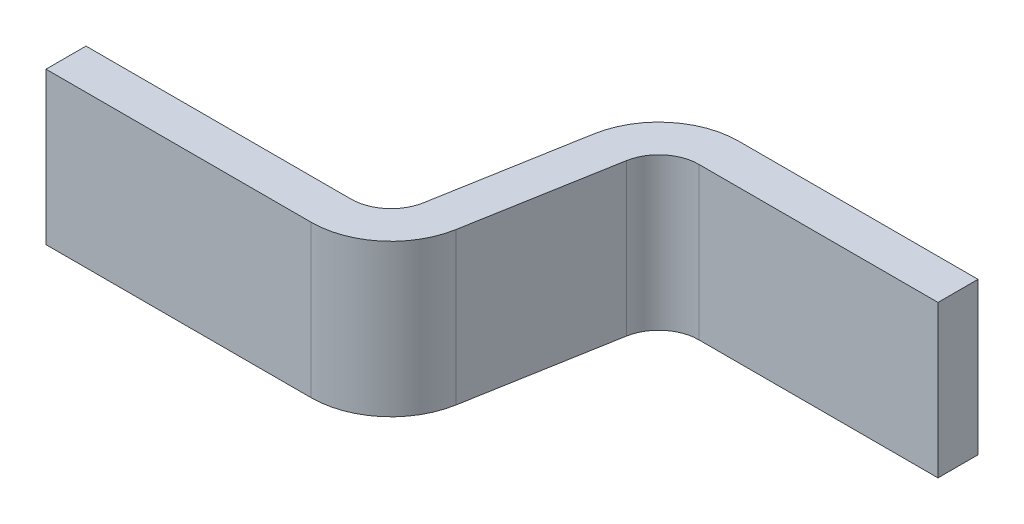
ISO-10303-21;
HEADER;
FILE_DESCRIPTION(('STEP AP214'),'2;1');
FILE_NAME('part.step','',(''),(''),'','','');
FILE_SCHEMA(('AUTOMOTIVE_DESIGN { 1 0 10303 214 1 1 1 1 }'));
ENDSEC;
DATA;
#1=APPLICATION_CONTEXT('core data for automotive mechanical design processes');
#2=APPLICATION_PROTOCOL_DEFINITION('international standard','automotive_design',2000,#1);
#3=PRODUCT_CONTEXT('',#1,'mechanical');
#4=PRODUCT('Part','Part','',(#3));
#5=PRODUCT_RELATED_PRODUCT_CATEGORY('part','',(#4));
#6=PRODUCT_DEFINITION_FORMATION('','',#4);
#7=PRODUCT_DEFINITION_CONTEXT('part definition',#1,'design');
#8=PRODUCT_DEFINITION('design','',#6,#7);
#9=PRODUCT_DEFINITION_SHAPE('','',#8);
#10=(LENGTH_UNIT() NAMED_UNIT(*) SI_UNIT(.MILLI.,.METRE.));
#11=(NAMED_UNIT(*) PLANE_ANGLE_UNIT() SI_UNIT($,.RADIAN.));
#12=(NAMED_UNIT(*) SI_UNIT($,.STERADIAN.) SOLID_ANGLE_UNIT());
#13=UNCERTAINTY_MEASURE_WITH_UNIT(LENGTH_MEASURE(1.E-05),#10,'distance_accuracy_value','');
#14=(GEOMETRIC_REPRESENTATION_CONTEXT(3) GLOBAL_UNCERTAINTY_ASSIGNED_CONTEXT((#13)) GLOBAL_UNIT_ASSIGNED_CONTEXT((#10,
#11,#12)) REPRESENTATION_CONTEXT('',''));
#15=CARTESIAN_POINT('',(0.,0.,0.));
#16=DIRECTION('',(0.,0.,1.));
#17=DIRECTION('',(1.,0.,0.));
#18=AXIS2_PLACEMENT_3D('',#15,#16,#17);
#19=CARTESIAN_POINT('',(2.043923101205,0.38,0.2));
#20=DIRECTION('',(0.,0.,-1.));
#21=DIRECTION('',(-1.,0.,0.));
#22=AXIS2_PLACEMENT_3D('',#19,#20,#21);
#23=PLANE('',#22);
#24=DIRECTION('',(1.,0.,0.));
#25=VECTOR('',#24,1.);
#26=CARTESIAN_POINT('',(2.043923101205,0.38,0.2));
#27=LINE('',#26,#25);
#28=CARTESIAN_POINT('',(3.24,0.38,0.2));
#29=VERTEX_POINT('',#28);
#30=CARTESIAN_POINT('',(2.043923101205,0.38,0.2));
#31=VERTEX_POINT('',#30);
#32=EDGE_CURVE('E153',#29,#31,#27,.F.);
#33=ORIENTED_EDGE('',*,*,#32,.T.);
#34=DIRECTION('',(0.,-1.,0.));
#35=VECTOR('',#34,1.);
#36=CARTESIAN_POINT('',(2.043923101205,0.38,0.2));
#37=LINE('',#36,#35);
#38=CARTESIAN_POINT('',(2.043923101205,-0.38,0.2));
#39=VERTEX_POINT('',#38);
#40=EDGE_CURVE('E99',#31,#39,#37,.T.);
#41=ORIENTED_EDGE('',*,*,#40,.T.);
#42=DIRECTION('',(1.,0.,0.));
#43=VECTOR('',#42,1.);
#44=CARTESIAN_POINT('',(2.043923101205,-0.38,0.2));
#45=LINE('',#44,#43);
#46=CARTESIAN_POINT('',(3.24,-0.38,0.2));
#47=VERTEX_POINT('',#46);
#48=EDGE_CURVE('E134',#39,#47,#45,.T.);
#49=ORIENTED_EDGE('',*,*,#48,.T.);
#50=DIRECTION('',(0.,1.,0.));
#51=VECTOR('',#50,1.);
#52=CARTESIAN_POINT('',(3.24,-0.38,0.2));
#53=LINE('',#52,#51);
#54=EDGE_CURVE('E150',#47,#29,#53,.T.);
#55=ORIENTED_EDGE('',*,*,#54,.T.);
#56=EDGE_LOOP('',(#33,#41,#49,#55));
#57=FACE_BOUND('',#56,.T.);
#58=ADVANCED_FACE('F17',(#57),#23,.F.);
#59=CARTESIAN_POINT('',(3.24,-0.38,0.));
#60=DIRECTION('',(-1.,0.,0.));
#61=DIRECTION('',(0.,0.,1.));
#62=AXIS2_PLACEMENT_3D('',#59,#60,#61);
#63=PLANE('',#62);
#64=DIRECTION('',(0.,0.,1.));
#65=VECTOR('',#64,1.);
#66=CARTESIAN_POINT('',(3.24,0.38,0.));
#67=LINE('',#66,#65);
#68=CARTESIAN_POINT('',(3.24,0.38,0.));
#69=VERTEX_POINT('',#68);
#70=EDGE_CURVE('E137',#29,#69,#67,.F.);
#71=ORIENTED_EDGE('',*,*,#70,.F.);
#72=ORIENTED_EDGE('',*,*,#54,.F.);
#73=DIRECTION('',(0.,0.,1.));
#74=VECTOR('',#73,1.);
#75=CARTESIAN_POINT('',(3.24,-0.38,0.2));
#76=LINE('',#75,#74);
#77=CARTESIAN_POINT('',(3.24,-0.38,0.));
#78=VERTEX_POINT('',#77);
#79=EDGE_CURVE('E133',#47,#78,#76,.F.);
#80=ORIENTED_EDGE('',*,*,#79,.T.);
#81=DIRECTION('',(0.,1.,0.));
#82=VECTOR('',#81,1.);
#83=CARTESIAN_POINT('',(3.24,-0.38,0.));
#84=LINE('',#83,#82);
#85=EDGE_CURVE('E125',#78,#69,#84,.T.);
#86=ORIENTED_EDGE('',*,*,#85,.T.);
#87=EDGE_LOOP('',(#71,#72,#80,#86));
#88=FACE_BOUND('',#87,.T.);
#89=ADVANCED_FACE('F260',(#88),#63,.F.);
#90=CARTESIAN_POINT('',(2.043923101205,0.38,0.4));
#91=DIRECTION('',(0.,-1.,0.));
#92=DIRECTION('',(0.,0.,-1.));
#93=AXIS2_PLACEMENT_3D('',#90,#91,#92);
#94=CYLINDRICAL_SURFACE('',#93,0.2);
#95=CARTESIAN_POINT('',(2.043923101205,0.38,0.4));
#96=DIRECTION('',(0.,-1.,0.));
#97=DIRECTION('',(0.,0.,-1.));
#98=AXIS2_PLACEMENT_3D('',#95,#96,#97);
#99=CIRCLE('',#98,0.2);
#100=CARTESIAN_POINT('',(1.84696155060227,0.38,0.365270364466852));
#101=VERTEX_POINT('',#100);
#102=EDGE_CURVE('E20',#101,#31,#99,.T.);
#103=ORIENTED_EDGE('',*,*,#102,.F.);
#104=DIRECTION('',(0.,1.,0.));
#105=VECTOR('',#104,1.);
#106=CARTESIAN_POINT('',(1.84696155060241,0.38,0.365270364467072));
#107=LINE('',#106,#105);
#108=CARTESIAN_POINT('',(1.84696155060227,-0.38,0.365270364466852));
#109=VERTEX_POINT('',#108);
#110=EDGE_CURVE('E90',#101,#109,#107,.F.);
#111=ORIENTED_EDGE('',*,*,#110,.T.);
#112=CARTESIAN_POINT('',(2.043923101205,-0.38,0.4));
#113=DIRECTION('',(0.,-1.,0.));
#114=DIRECTION('',(0.,0.,-1.));
#115=AXIS2_PLACEMENT_3D('',#112,#113,#114);
#116=CIRCLE('',#115,0.2);
#117=EDGE_CURVE('E146',#39,#109,#116,.F.);
#118=ORIENTED_EDGE('',*,*,#117,.F.);
#119=ORIENTED_EDGE('',*,*,#40,.F.);
#120=EDGE_LOOP('',(#103,#111,#118,#119));
#121=FACE_BOUND('',#120,.T.);
#122=ADVANCED_FACE('F114',(#121),#94,.F.);
#123=CARTESIAN_POINT('',(1.719267507239,0.38,1.089459271067));
#124=DIRECTION('',(-0.98480775301219,0.,-0.173648177667033));
#125=DIRECTION('',(-0.173648177667033,0.,0.98480775301219));
#126=AXIS2_PLACEMENT_3D('',#123,#124,#125);
#127=PLANE('',#126);
#128=DIRECTION('',(-0.173648177666479,0.,0.984807753012288));
#129=VECTOR('',#128,1.);
#130=CARTESIAN_POINT('',(1.846961550602,0.38,0.365270364467));
#131=LINE('',#130,#129);
#132=CARTESIAN_POINT('',(1.71926750723896,0.38,1.0894592710668));
#133=VERTEX_POINT('',#132);
#134=EDGE_CURVE('E94',#101,#133,#131,.T.);
#135=ORIENTED_EDGE('',*,*,#134,.T.);
#136=DIRECTION('',(0.,1.,0.));
#137=VECTOR('',#136,1.);
#138=CARTESIAN_POINT('',(1.71926750723885,0.38,1.08945927106697));
#139=LINE('',#138,#137);
#140=CARTESIAN_POINT('',(1.71926750723896,-0.38,1.0894592710668));
#141=VERTEX_POINT('',#140);
#142=EDGE_CURVE('E111',#141,#133,#139,.T.);
#143=ORIENTED_EDGE('',*,*,#142,.F.);
#144=DIRECTION('',(0.173648177666479,0.,-0.984807753012288));
#145=VECTOR('',#144,1.);
#146=CARTESIAN_POINT('',(1.719267507239,-0.38,1.089459271067));
#147=LINE('',#146,#145);
#148=EDGE_CURVE('E95',#141,#109,#147,.T.);
#149=ORIENTED_EDGE('',*,*,#148,.T.);
#150=ORIENTED_EDGE('',*,*,#110,.F.);
#151=EDGE_LOOP('',(#135,#143,#149,#150));
#152=FACE_BOUND('',#151,.T.);
#153=ADVANCED_FACE('F92',(#152),#127,.F.);
#154=CARTESIAN_POINT('',(2.043923101205,-0.38,0.));
#155=DIRECTION('',(0.,0.,1.));
#156=DIRECTION('',(1.,0.,0.));
#157=AXIS2_PLACEMENT_3D('',#154,#155,#156);
#158=PLANE('',#157);
#159=DIRECTION('',(1.,0.,0.));
#160=VECTOR('',#159,1.);
#161=CARTESIAN_POINT('',(2.043923101205,-0.38,0.));
#162=LINE('',#161,#160);
#163=CARTESIAN_POINT('',(2.043923101205,-0.38,0.));
#164=VERTEX_POINT('',#163);
#165=EDGE_CURVE('E118',#164,#78,#162,.T.);
#166=ORIENTED_EDGE('',*,*,#165,.F.);
#167=DIRECTION('',(0.,-1.,0.));
#168=VECTOR('',#167,1.);
#169=CARTESIAN_POINT('',(2.043923101205,-0.38,0.));
#170=LINE('',#169,#168);
#171=CARTESIAN_POINT('',(2.043923101205,0.38,0.));
#172=VERTEX_POINT('',#171);
#173=EDGE_CURVE('E174',#172,#164,#170,.T.);
#174=ORIENTED_EDGE('',*,*,#173,.F.);
#175=DIRECTION('',(1.,0.,0.));
#176=VECTOR('',#175,1.);
#177=CARTESIAN_POINT('',(2.043923101205,0.38,0.));
#178=LINE('',#177,#176);
#179=EDGE_CURVE('E116',#69,#172,#178,.F.);
#180=ORIENTED_EDGE('',*,*,#179,.F.);
#181=ORIENTED_EDGE('',*,*,#85,.F.);
#182=EDGE_LOOP('',(#166,#174,#180,#181));
#183=FACE_BOUND('',#182,.T.);
#184=ADVANCED_FACE('F262',(#183),#158,.F.);
#185=CARTESIAN_POINT('',(1.325344406034,0.38,1.02));
#186=DIRECTION('',(0.,1.,0.));
#187=DIRECTION('',(0.,0.,1.));
#188=AXIS2_PLACEMENT_3D('',#185,#186,#187);
#189=CYLINDRICAL_SURFACE('',#188,0.4);
#190=CARTESIAN_POINT('',(1.325344406034,0.38,1.02));
#191=DIRECTION('',(0.,1.,0.));
#192=DIRECTION('',(0.,0.,1.));
#193=AXIS2_PLACEMENT_3D('',#190,#191,#192);
#194=CIRCLE('',#193,0.4);
#195=CARTESIAN_POINT('',(1.325344406034,0.38,1.42));
#196=VERTEX_POINT('',#195);
#197=EDGE_CURVE('E110',#196,#133,#194,.T.);
#198=ORIENTED_EDGE('',*,*,#197,.F.);
#199=DIRECTION('',(0.,1.,0.));
#200=VECTOR('',#199,1.);
#201=CARTESIAN_POINT('',(1.325344406034,0.38,1.42));
#202=LINE('',#201,#200);
#203=CARTESIAN_POINT('',(1.325344406034,-0.38,1.42));
#204=VERTEX_POINT('',#203);
#205=EDGE_CURVE('E171',#196,#204,#202,.F.);
#206=ORIENTED_EDGE('',*,*,#205,.T.);
#207=CARTESIAN_POINT('',(1.325344406034,-0.38,1.02));
#208=DIRECTION('',(0.,1.,0.));
#209=DIRECTION('',(0.,0.,1.));
#210=AXIS2_PLACEMENT_3D('',#207,#208,#209);
#211=CIRCLE('',#210,0.4);
#212=EDGE_CURVE('E167',#141,#204,#211,.F.);
#213=ORIENTED_EDGE('',*,*,#212,.F.);
#214=ORIENTED_EDGE('',*,*,#142,.T.);
#215=EDGE_LOOP('',(#198,#206,#213,#214));
#216=FACE_BOUND('',#215,.T.);
#217=ADVANCED_FACE('F264',(#216),#189,.T.);
#218=CARTESIAN_POINT('',(2.043923101205,-0.38,0.4));
#219=DIRECTION('',(0.,-1.,0.));
#220=DIRECTION('',(0.,0.,-1.));
#221=AXIS2_PLACEMENT_3D('',#218,#219,#220);
#222=CYLINDRICAL_SURFACE('',#221,0.4);
#223=CARTESIAN_POINT('',(2.043923101205,-0.38,0.4));
#224=DIRECTION('',(0.,-1.,0.));
#225=DIRECTION('',(0.,0.,-1.));
#226=AXIS2_PLACEMENT_3D('',#223,#224,#225);
#227=CIRCLE('',#226,0.4);
#228=CARTESIAN_POINT('',(1.65000000000027,-0.38,0.330540728933129));
#229=VERTEX_POINT('',#228);
#230=EDGE_CURVE('E172',#164,#229,#227,.F.);
#231=ORIENTED_EDGE('',*,*,#230,.T.);
#232=DIRECTION('',(0.,1.,0.));
#233=VECTOR('',#232,1.);
#234=CARTESIAN_POINT('',(1.65000000000041,-0.38,0.330540728933072));
#235=LINE('',#234,#233);
#236=CARTESIAN_POINT('',(1.65000000000027,0.38,0.330540728933129));
#237=VERTEX_POINT('',#236);
#238=EDGE_CURVE('E182',#229,#237,#235,.T.);
#239=ORIENTED_EDGE('',*,*,#238,.T.);
#240=CARTESIAN_POINT('',(2.043923101205,0.38,0.4));
#241=DIRECTION('',(0.,-1.,0.));
#242=DIRECTION('',(0.,0.,-1.));
#243=AXIS2_PLACEMENT_3D('',#240,#241,#242);
#244=CIRCLE('',#243,0.4);
#245=EDGE_CURVE('E175',#237,#172,#244,.T.);
#246=ORIENTED_EDGE('',*,*,#245,.T.);
#247=ORIENTED_EDGE('',*,*,#173,.T.);
#248=EDGE_LOOP('',(#231,#239,#246,#247));
#249=FACE_BOUND('',#248,.T.);
#250=ADVANCED_FACE('F188',(#249),#222,.T.);
#251=CARTESIAN_POINT('',(0.,0.38,1.42));
#252=DIRECTION('',(0.,0.,-1.));
#253=DIRECTION('',(-1.,0.,0.));
#254=AXIS2_PLACEMENT_3D('',#251,#252,#253);
#255=PLANE('',#254);
#256=DIRECTION('',(1.,0.,0.));
#257=VECTOR('',#256,1.);
#258=CARTESIAN_POINT('',(0.,0.38,1.42));
#259=LINE('',#258,#257);
#260=CARTESIAN_POINT('',(0.,0.38,1.42));
#261=VERTEX_POINT('',#260);
#262=EDGE_CURVE('E201',#196,#261,#259,.F.);
#263=ORIENTED_EDGE('',*,*,#262,.T.);
#264=DIRECTION('',(0.,1.,0.));
#265=VECTOR('',#264,1.);
#266=CARTESIAN_POINT('',(0.,-0.38,1.42));
#267=LINE('',#266,#265);
#268=CARTESIAN_POINT('',(0.,-0.38,1.42));
#269=VERTEX_POINT('',#268);
#270=EDGE_CURVE('E222',#269,#261,#267,.T.);
#271=ORIENTED_EDGE('',*,*,#270,.F.);
#272=DIRECTION('',(1.,0.,0.));
#273=VECTOR('',#272,1.);
#274=CARTESIAN_POINT('',(0.,-0.38,1.42));
#275=LINE('',#274,#273);
#276=EDGE_CURVE('E166',#269,#204,#275,.T.);
#277=ORIENTED_EDGE('',*,*,#276,.T.);
#278=ORIENTED_EDGE('',*,*,#205,.F.);
#279=EDGE_LOOP('',(#263,#271,#277,#278));
#280=FACE_BOUND('',#279,.T.);
#281=ADVANCED_FACE('F289',(#280),#255,.F.);
#282=CARTESIAN_POINT('',(1.522305956637,-0.38,1.054729635533));
#283=DIRECTION('',(0.98480775301219,0.,0.173648177667033));
#284=DIRECTION('',(0.173648177667033,0.,-0.98480775301219));
#285=AXIS2_PLACEMENT_3D('',#282,#283,#284);
#286=PLANE('',#285);
#287=DIRECTION('',(0.173648177667033,0.,-0.98480775301219));
#288=VECTOR('',#287,1.);
#289=CARTESIAN_POINT('',(1.522305956637,-0.38,1.054729635533));
#290=LINE('',#289,#288);
#291=CARTESIAN_POINT('',(1.52230595663672,-0.38,1.0547296355332));
#292=VERTEX_POINT('',#291);
#293=EDGE_CURVE('E196',#292,#229,#290,.T.);
#294=ORIENTED_EDGE('',*,*,#293,.F.);
#295=DIRECTION('',(0.,1.,0.));
#296=VECTOR('',#295,1.);
#297=CARTESIAN_POINT('',(1.52230595663652,-0.38,1.05472963553292));
#298=LINE('',#297,#296);
#299=CARTESIAN_POINT('',(1.52230595663672,0.38,1.0547296355332));
#300=VERTEX_POINT('',#299);
#301=EDGE_CURVE('E162',#292,#300,#298,.T.);
#302=ORIENTED_EDGE('',*,*,#301,.T.);
#303=DIRECTION('',(0.173648177667033,0.,-0.98480775301219));
#304=VECTOR('',#303,1.);
#305=CARTESIAN_POINT('',(1.522305956637,0.38,1.054729635533));
#306=LINE('',#305,#304);
#307=EDGE_CURVE('E169',#237,#300,#306,.F.);
#308=ORIENTED_EDGE('',*,*,#307,.F.);
#309=ORIENTED_EDGE('',*,*,#238,.F.);
#310=EDGE_LOOP('',(#294,#302,#308,#309));
#311=FACE_BOUND('',#310,.T.);
#312=ADVANCED_FACE('F286',(#311),#286,.F.);
#313=CARTESIAN_POINT('',(0.,0.38,1.22));
#314=DIRECTION('',(0.,-1.,0.));
#315=DIRECTION('',(0.,0.,-1.));
#316=AXIS2_PLACEMENT_3D('',#313,#314,#315);
#317=PLANE('',#316);
#318=DIRECTION('',(1.,0.,0.));
#319=VECTOR('',#318,1.);
#320=CARTESIAN_POINT('',(0.,0.38,1.22));
#321=LINE('',#320,#319);
#322=CARTESIAN_POINT('',(1.325344406034,0.38,1.22));
#323=VERTEX_POINT('',#322);
#324=CARTESIAN_POINT('',(0.,0.38,1.22));
#325=VERTEX_POINT('',#324);
#326=EDGE_CURVE('E207',#323,#325,#321,.F.);
#327=ORIENTED_EDGE('',*,*,#326,.T.);
#328=DIRECTION('',(0.,0.,1.));
#329=VECTOR('',#328,1.);
#330=CARTESIAN_POINT('',(0.,0.38,1.22));
#331=LINE('',#330,#329);
#332=EDGE_CURVE('E219',#261,#325,#331,.F.);
#333=ORIENTED_EDGE('',*,*,#332,.F.);
#334=ORIENTED_EDGE('',*,*,#262,.F.);
#335=ORIENTED_EDGE('',*,*,#197,.T.);
#336=ORIENTED_EDGE('',*,*,#134,.F.);
#337=ORIENTED_EDGE('',*,*,#102,.T.);
#338=ORIENTED_EDGE('',*,*,#32,.F.);
#339=ORIENTED_EDGE('',*,*,#70,.T.);
#340=ORIENTED_EDGE('',*,*,#179,.T.);
#341=ORIENTED_EDGE('',*,*,#245,.F.);
#342=ORIENTED_EDGE('',*,*,#307,.T.);
#343=CARTESIAN_POINT('',(1.325344406034,0.38,1.02));
#344=DIRECTION('',(0.,1.,0.));
#345=DIRECTION('',(0.,0.,1.));
#346=AXIS2_PLACEMENT_3D('',#343,#344,#345);
#347=CIRCLE('',#346,0.2);
#348=EDGE_CURVE('E163',#300,#323,#347,.F.);
#349=ORIENTED_EDGE('',*,*,#348,.T.);
#350=EDGE_LOOP('',(#327,#333,#334,#335,#336,#337,#338,#339,#340,#341,#342,#349));
#351=FACE_BOUND('',#350,.T.);
#352=ADVANCED_FACE('F105',(#351),#317,.F.);
#353=CARTESIAN_POINT('',(0.,-0.38,1.22));
#354=DIRECTION('',(-1.,0.,0.));
#355=DIRECTION('',(0.,0.,1.));
#356=AXIS2_PLACEMENT_3D('',#353,#354,#355);
#357=PLANE('',#356);
#358=ORIENTED_EDGE('',*,*,#332,.T.);
#359=DIRECTION('',(0.,1.,0.));
#360=VECTOR('',#359,1.);
#361=CARTESIAN_POINT('',(0.,-0.38,1.22));
#362=LINE('',#361,#360);
#363=CARTESIAN_POINT('',(0.,-0.38,1.22));
#364=VERTEX_POINT('',#363);
#365=EDGE_CURVE('E209',#325,#364,#362,.F.);
#366=ORIENTED_EDGE('',*,*,#365,.T.);
#367=DIRECTION('',(0.,0.,1.));
#368=VECTOR('',#367,1.);
#369=CARTESIAN_POINT('',(0.,-0.38,1.42));
#370=LINE('',#369,#368);
#371=EDGE_CURVE('E212',#364,#269,#370,.T.);
#372=ORIENTED_EDGE('',*,*,#371,.T.);
#373=ORIENTED_EDGE('',*,*,#270,.T.);
#374=EDGE_LOOP('',(#358,#366,#372,#373));
#375=FACE_BOUND('',#374,.T.);
#376=ADVANCED_FACE('F240',(#375),#357,.T.);
#377=CARTESIAN_POINT('',(0.,-0.38,1.42));
#378=DIRECTION('',(0.,1.,0.));
#379=DIRECTION('',(0.,0.,1.));
#380=AXIS2_PLACEMENT_3D('',#377,#378,#379);
#381=PLANE('',#380);
#382=ORIENTED_EDGE('',*,*,#276,.F.);
#383=ORIENTED_EDGE('',*,*,#371,.F.);
#384=DIRECTION('',(1.,0.,0.));
#385=VECTOR('',#384,1.);
#386=CARTESIAN_POINT('',(0.,-0.38,1.22));
#387=LINE('',#386,#385);
#388=CARTESIAN_POINT('',(1.325344406034,-0.38,1.22));
#389=VERTEX_POINT('',#388);
#390=EDGE_CURVE('E26',#364,#389,#387,.T.);
#391=ORIENTED_EDGE('',*,*,#390,.T.);
#392=CARTESIAN_POINT('',(1.325344406034,-0.38,1.02));
#393=DIRECTION('',(0.,1.,0.));
#394=DIRECTION('',(0.,0.,1.));
#395=AXIS2_PLACEMENT_3D('',#392,#393,#394);
#396=CIRCLE('',#395,0.2);
#397=EDGE_CURVE('E34',#389,#292,#396,.T.);
#398=ORIENTED_EDGE('',*,*,#397,.T.);
#399=ORIENTED_EDGE('',*,*,#293,.T.);
#400=ORIENTED_EDGE('',*,*,#230,.F.);
#401=ORIENTED_EDGE('',*,*,#165,.T.);
#402=ORIENTED_EDGE('',*,*,#79,.F.);
#403=ORIENTED_EDGE('',*,*,#48,.F.);
#404=ORIENTED_EDGE('',*,*,#117,.T.);
#405=ORIENTED_EDGE('',*,*,#148,.F.);
#406=ORIENTED_EDGE('',*,*,#212,.T.);
#407=EDGE_LOOP('',(#382,#383,#391,#398,#399,#400,#401,#402,#403,#404,#405,#406));
#408=FACE_BOUND('',#407,.T.);
#409=ADVANCED_FACE('F194',(#408),#381,.F.);
#410=CARTESIAN_POINT('',(1.325344406034,-0.38,1.02));
#411=DIRECTION('',(0.,1.,0.));
#412=DIRECTION('',(0.,0.,1.));
#413=AXIS2_PLACEMENT_3D('',#410,#411,#412);
#414=CYLINDRICAL_SURFACE('',#413,0.2);
#415=ORIENTED_EDGE('',*,*,#397,.F.);
#416=DIRECTION('',(0.,1.,0.));
#417=VECTOR('',#416,1.);
#418=CARTESIAN_POINT('',(1.325344406034,-0.38,1.22));
#419=LINE('',#418,#417);
#420=EDGE_CURVE('E11',#389,#323,#419,.T.);
#421=ORIENTED_EDGE('',*,*,#420,.T.);
#422=ORIENTED_EDGE('',*,*,#348,.F.);
#423=ORIENTED_EDGE('',*,*,#301,.F.);
#424=EDGE_LOOP('',(#415,#421,#422,#423));
#425=FACE_BOUND('',#424,.T.);
#426=ADVANCED_FACE('F246',(#425),#414,.F.);
#427=CARTESIAN_POINT('',(0.,-0.38,1.22));
#428=DIRECTION('',(0.,0.,1.));
#429=DIRECTION('',(1.,0.,0.));
#430=AXIS2_PLACEMENT_3D('',#427,#428,#429);
#431=PLANE('',#430);
#432=ORIENTED_EDGE('',*,*,#390,.F.);
#433=ORIENTED_EDGE('',*,*,#365,.F.);
#434=ORIENTED_EDGE('',*,*,#326,.F.);
#435=ORIENTED_EDGE('',*,*,#420,.F.);
#436=EDGE_LOOP('',(#432,#433,#434,#435));
#437=FACE_BOUND('',#436,.T.);
#438=ADVANCED_FACE('F245',(#437),#431,.F.);
#439=CLOSED_SHELL('',(#58,#89,#122,#153,#184,#217,#250,#281,#312,#352,#376,#409,#426,#438));
#440=MANIFOLD_SOLID_BREP('B1',#439);
#441=ADVANCED_BREP_SHAPE_REPRESENTATION('',(#18,#440),#14);
#442=SHAPE_DEFINITION_REPRESENTATION(#9,#441);
ENDSEC;
END-ISO-10303-21;
